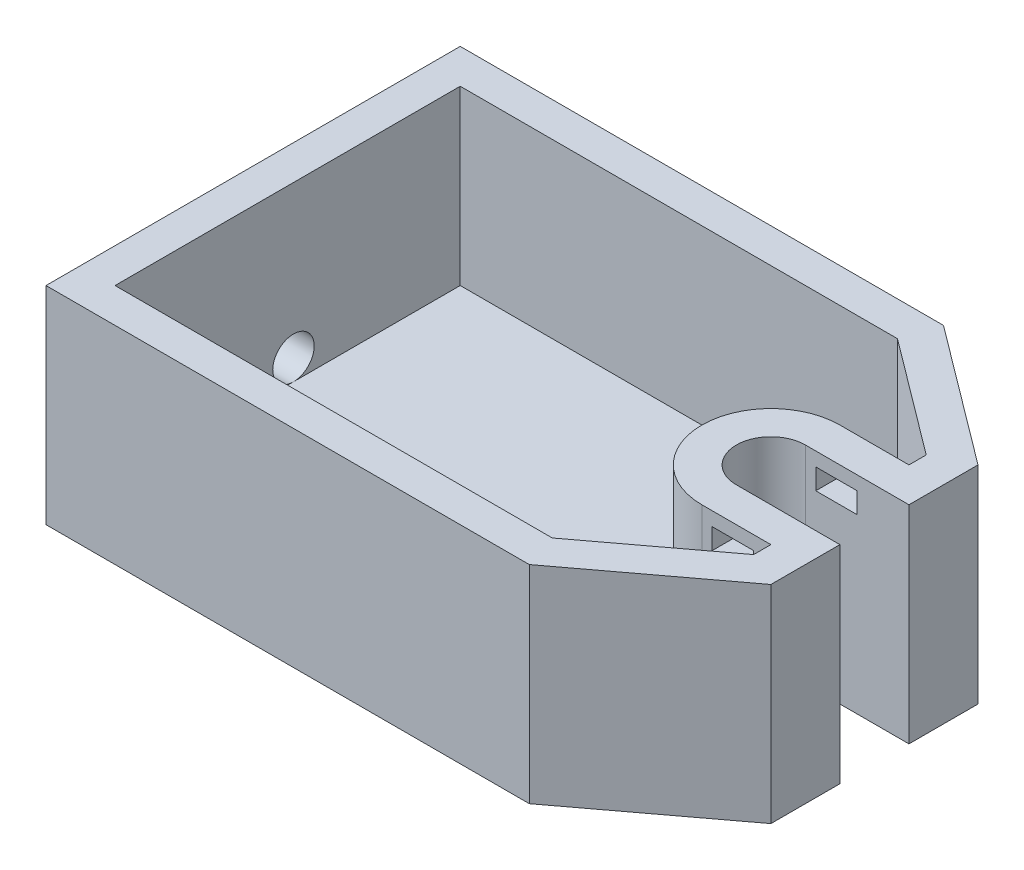
ISO-10303-21;
HEADER;
FILE_DESCRIPTION(('STEP AP214'),'2;1');
FILE_NAME('part.step','',(''),(''),'','','');
FILE_SCHEMA(('AUTOMOTIVE_DESIGN { 1 0 10303 214 1 1 1 1 }'));
ENDSEC;
DATA;
#1=APPLICATION_CONTEXT('core data for automotive mechanical design processes');
#2=APPLICATION_PROTOCOL_DEFINITION('international standard','automotive_design',2000,#1);
#3=PRODUCT_CONTEXT('',#1,'mechanical');
#4=PRODUCT('Part','Part','',(#3));
#5=PRODUCT_RELATED_PRODUCT_CATEGORY('part','',(#4));
#6=PRODUCT_DEFINITION_FORMATION('','',#4);
#7=PRODUCT_DEFINITION_CONTEXT('part definition',#1,'design');
#8=PRODUCT_DEFINITION('design','',#6,#7);
#9=PRODUCT_DEFINITION_SHAPE('','',#8);
#10=(LENGTH_UNIT() NAMED_UNIT(*) SI_UNIT(.MILLI.,.METRE.));
#11=(NAMED_UNIT(*) PLANE_ANGLE_UNIT() SI_UNIT($,.RADIAN.));
#12=(NAMED_UNIT(*) SI_UNIT($,.STERADIAN.) SOLID_ANGLE_UNIT());
#13=UNCERTAINTY_MEASURE_WITH_UNIT(LENGTH_MEASURE(1.E-05),#10,'distance_accuracy_value','');
#14=(GEOMETRIC_REPRESENTATION_CONTEXT(3) GLOBAL_UNCERTAINTY_ASSIGNED_CONTEXT((#13)) GLOBAL_UNIT_ASSIGNED_CONTEXT((#10,
#11,#12)) REPRESENTATION_CONTEXT('',''));
#15=CARTESIAN_POINT('',(0.,0.,0.));
#16=DIRECTION('',(0.,0.,1.));
#17=DIRECTION('',(1.,0.,0.));
#18=AXIS2_PLACEMENT_3D('',#15,#16,#17);
#19=CARTESIAN_POINT('',(228.6,76.2,0.));
#20=DIRECTION('',(1.,0.,0.));
#21=DIRECTION('',(0.,0.,-1.));
#22=AXIS2_PLACEMENT_3D('',#19,#20,#21);
#23=PLANE('',#22);
#24=DIRECTION('',(0.,0.,1.));
#25=VECTOR('',#24,1.);
#26=CARTESIAN_POINT('',(228.6,0.,0.));
#27=LINE('',#26,#25);
#28=CARTESIAN_POINT('',(228.6,0.,-114.3));
#29=VERTEX_POINT('',#28);
#30=CARTESIAN_POINT('',(228.6,0.,-88.9));
#31=VERTEX_POINT('',#30);
#32=EDGE_CURVE('E413',#29,#31,#27,.T.);
#33=ORIENTED_EDGE('',*,*,#32,.F.);
#34=DIRECTION('',(0.,-1.,0.));
#35=VECTOR('',#34,1.);
#36=CARTESIAN_POINT('',(228.6,76.2,-114.3));
#37=LINE('',#36,#35);
#38=CARTESIAN_POINT('',(228.6,76.2,-114.3));
#39=VERTEX_POINT('',#38);
#40=EDGE_CURVE('E12',#39,#29,#37,.T.);
#41=ORIENTED_EDGE('',*,*,#40,.F.);
#42=DIRECTION('',(0.,0.,1.));
#43=VECTOR('',#42,1.);
#44=CARTESIAN_POINT('',(228.6,76.2,0.));
#45=LINE('',#44,#43);
#46=CARTESIAN_POINT('',(228.6,76.2,-88.9));
#47=VERTEX_POINT('',#46);
#48=EDGE_CURVE('E414',#39,#47,#45,.T.);
#49=ORIENTED_EDGE('',*,*,#48,.T.);
#50=DIRECTION('',(0.,-1.,0.));
#51=VECTOR('',#50,1.);
#52=CARTESIAN_POINT('',(228.6,76.2,-88.9));
#53=LINE('',#52,#51);
#54=EDGE_CURVE('E443',#47,#31,#53,.T.);
#55=ORIENTED_EDGE('',*,*,#54,.T.);
#56=EDGE_LOOP('',(#33,#41,#49,#55));
#57=FACE_BOUND('',#56,.T.);
#58=ADVANCED_FACE('F37',(#57),#23,.T.);
#59=CARTESIAN_POINT('',(137.16,76.2,-182.88));
#60=DIRECTION('',(0.6,0.,-0.8));
#61=DIRECTION('',(-0.8,0.,-0.6));
#62=AXIS2_PLACEMENT_3D('',#59,#60,#61);
#63=PLANE('',#62);
#64=DIRECTION('',(0.8,0.,0.6));
#65=VECTOR('',#64,1.);
#66=CARTESIAN_POINT('',(137.16,0.,-182.88));
#67=LINE('',#66,#65);
#68=CARTESIAN_POINT('',(177.8,0.,-152.4));
#69=VERTEX_POINT('',#68);
#70=EDGE_CURVE('E446',#69,#29,#67,.T.);
#71=ORIENTED_EDGE('',*,*,#70,.F.);
#72=DIRECTION('',(0.,-1.,0.));
#73=VECTOR('',#72,1.);
#74=CARTESIAN_POINT('',(177.8,76.2,-152.4));
#75=LINE('',#74,#73);
#76=CARTESIAN_POINT('',(177.8,76.2,-152.4));
#77=VERTEX_POINT('',#76);
#78=EDGE_CURVE('E44',#77,#69,#75,.T.);
#79=ORIENTED_EDGE('',*,*,#78,.F.);
#80=DIRECTION('',(0.8,0.,0.6));
#81=VECTOR('',#80,1.);
#82=CARTESIAN_POINT('',(137.16,76.2,-182.88));
#83=LINE('',#82,#81);
#84=EDGE_CURVE('E417',#77,#39,#83,.T.);
#85=ORIENTED_EDGE('',*,*,#84,.T.);
#86=ORIENTED_EDGE('',*,*,#40,.T.);
#87=EDGE_LOOP('',(#71,#79,#85,#86));
#88=FACE_BOUND('',#87,.T.);
#89=ADVANCED_FACE('F493',(#88),#63,.T.);
#90=CARTESIAN_POINT('',(0.,76.2,-152.4));
#91=DIRECTION('',(0.,0.,-1.));
#92=DIRECTION('',(-1.,0.,0.));
#93=AXIS2_PLACEMENT_3D('',#90,#91,#92);
#94=PLANE('',#93);
#95=DIRECTION('',(1.,0.,0.));
#96=VECTOR('',#95,1.);
#97=CARTESIAN_POINT('',(0.,0.,-152.4));
#98=LINE('',#97,#96);
#99=CARTESIAN_POINT('',(0.,0.,-152.4));
#100=VERTEX_POINT('',#99);
#101=EDGE_CURVE('E449',#100,#69,#98,.T.);
#102=ORIENTED_EDGE('',*,*,#101,.F.);
#103=DIRECTION('',(0.,-1.,0.));
#104=VECTOR('',#103,1.);
#105=CARTESIAN_POINT('',(0.,76.2,-152.4));
#106=LINE('',#105,#104);
#107=CARTESIAN_POINT('',(0.,76.2,-152.4));
#108=VERTEX_POINT('',#107);
#109=EDGE_CURVE('E485',#108,#100,#106,.T.);
#110=ORIENTED_EDGE('',*,*,#109,.F.);
#111=DIRECTION('',(1.,0.,0.));
#112=VECTOR('',#111,1.);
#113=CARTESIAN_POINT('',(0.,76.2,-152.4));
#114=LINE('',#113,#112);
#115=EDGE_CURVE('E421',#108,#77,#114,.T.);
#116=ORIENTED_EDGE('',*,*,#115,.T.);
#117=ORIENTED_EDGE('',*,*,#78,.T.);
#118=EDGE_LOOP('',(#102,#110,#116,#117));
#119=FACE_BOUND('',#118,.T.);
#120=ADVANCED_FACE('F489',(#119),#94,.T.);
#121=CARTESIAN_POINT('',(0.,76.2,0.));
#122=DIRECTION('',(-1.,0.,0.));
#123=DIRECTION('',(0.,0.,1.));
#124=AXIS2_PLACEMENT_3D('',#121,#122,#123);
#125=PLANE('',#124);
#126=CARTESIAN_POINT('',(0.,20.32,-78.3433518149517));
#127=DIRECTION('',(-1.,0.,0.));
#128=DIRECTION('',(0.,0.,1.));
#129=AXIS2_PLACEMENT_3D('',#126,#127,#128);
#130=CIRCLE('',#129,7.62);
#131=CARTESIAN_POINT('',(0.,20.32,-70.7233518149518));
#132=VERTEX_POINT('',#131);
#133=EDGE_CURVE('E307',#132,#132,#130,.T.);
#134=ORIENTED_EDGE('',*,*,#133,.F.);
#135=EDGE_LOOP('',(#134));
#136=FACE_BOUND('',#135,.T.);
#137=DIRECTION('',(0.,1.,0.));
#138=VECTOR('',#137,1.);
#139=CARTESIAN_POINT('',(0.,15.24,-25.4850808170089));
#140=LINE('',#139,#138);
#141=CARTESIAN_POINT('',(0.,15.24,-25.4850808170089));
#142=VERTEX_POINT('',#141);
#143=CARTESIAN_POINT('',(0.,25.4,-25.4850808170089));
#144=VERTEX_POINT('',#143);
#145=EDGE_CURVE('E312',#142,#144,#140,.T.);
#146=ORIENTED_EDGE('',*,*,#145,.F.);
#147=DIRECTION('',(0.,0.,1.));
#148=VECTOR('',#147,1.);
#149=CARTESIAN_POINT('',(0.,15.24,-25.4850808170089));
#150=LINE('',#149,#148);
#151=CARTESIAN_POINT('',(0.,15.24,-35.6450808170089));
#152=VERTEX_POINT('',#151);
#153=EDGE_CURVE('E329',#152,#142,#150,.T.);
#154=ORIENTED_EDGE('',*,*,#153,.F.);
#155=DIRECTION('',(0.,-1.,0.));
#156=VECTOR('',#155,1.);
#157=CARTESIAN_POINT('',(0.,15.24,-35.6450808170089));
#158=LINE('',#157,#156);
#159=CARTESIAN_POINT('',(0.,25.4,-35.6450808170089));
#160=VERTEX_POINT('',#159);
#161=EDGE_CURVE('E326',#160,#152,#158,.T.);
#162=ORIENTED_EDGE('',*,*,#161,.F.);
#163=DIRECTION('',(0.,0.,-1.));
#164=VECTOR('',#163,1.);
#165=CARTESIAN_POINT('',(0.,25.4,-25.4850808170089));
#166=LINE('',#165,#164);
#167=EDGE_CURVE('E323',#144,#160,#166,.T.);
#168=ORIENTED_EDGE('',*,*,#167,.F.);
#169=EDGE_LOOP('',(#146,#154,#162,#168));
#170=FACE_BOUND('',#169,.T.);
#171=DIRECTION('',(0.,0.,-1.));
#172=VECTOR('',#171,1.);
#173=CARTESIAN_POINT('',(0.,0.,0.));
#174=LINE('',#173,#172);
#175=CARTESIAN_POINT('',(0.,0.,0.));
#176=VERTEX_POINT('',#175);
#177=EDGE_CURVE('E452',#176,#100,#174,.T.);
#178=ORIENTED_EDGE('',*,*,#177,.F.);
#179=DIRECTION('',(0.,-1.,0.));
#180=VECTOR('',#179,1.);
#181=CARTESIAN_POINT('',(0.,76.2,0.));
#182=LINE('',#181,#180);
#183=CARTESIAN_POINT('',(0.,76.2,0.));
#184=VERTEX_POINT('',#183);
#185=EDGE_CURVE('E483',#184,#176,#182,.T.);
#186=ORIENTED_EDGE('',*,*,#185,.F.);
#187=DIRECTION('',(0.,0.,-1.));
#188=VECTOR('',#187,1.);
#189=CARTESIAN_POINT('',(0.,76.2,0.));
#190=LINE('',#189,#188);
#191=EDGE_CURVE('E424',#184,#108,#190,.T.);
#192=ORIENTED_EDGE('',*,*,#191,.T.);
#193=ORIENTED_EDGE('',*,*,#109,.T.);
#194=EDGE_LOOP('',(#178,#186,#192,#193));
#195=FACE_BOUND('',#194,.T.);
#196=ADVANCED_FACE('F500',(#136,#170,#195),#125,.T.);
#197=CARTESIAN_POINT('',(0.,76.2,0.));
#198=DIRECTION('',(0.,0.,-1.));
#199=DIRECTION('',(-1.,0.,0.));
#200=AXIS2_PLACEMENT_3D('',#197,#198,#199);
#201=PLANE('',#200);
#202=DIRECTION('',(1.,0.,0.));
#203=VECTOR('',#202,1.);
#204=CARTESIAN_POINT('',(0.,0.,0.));
#205=LINE('',#204,#203);
#206=CARTESIAN_POINT('',(177.8,0.,0.));
#207=VERTEX_POINT('',#206);
#208=EDGE_CURVE('E455',#176,#207,#205,.T.);
#209=ORIENTED_EDGE('',*,*,#208,.T.);
#210=DIRECTION('',(0.,-1.,0.));
#211=VECTOR('',#210,1.);
#212=CARTESIAN_POINT('',(177.8,76.2,0.));
#213=LINE('',#212,#211);
#214=CARTESIAN_POINT('',(177.8,76.2,0.));
#215=VERTEX_POINT('',#214);
#216=EDGE_CURVE('E481',#215,#207,#213,.T.);
#217=ORIENTED_EDGE('',*,*,#216,.F.);
#218=DIRECTION('',(1.,0.,0.));
#219=VECTOR('',#218,1.);
#220=CARTESIAN_POINT('',(0.,76.2,0.));
#221=LINE('',#220,#219);
#222=EDGE_CURVE('E427',#184,#215,#221,.T.);
#223=ORIENTED_EDGE('',*,*,#222,.F.);
#224=ORIENTED_EDGE('',*,*,#185,.T.);
#225=EDGE_LOOP('',(#209,#217,#223,#224));
#226=FACE_BOUND('',#225,.T.);
#227=ADVANCED_FACE('F529',(#226),#201,.F.);
#228=CARTESIAN_POINT('',(64.0080000000001,76.2,85.344));
#229=DIRECTION('',(0.6,0.,0.8));
#230=DIRECTION('',(0.8,0.,-0.6));
#231=AXIS2_PLACEMENT_3D('',#228,#229,#230);
#232=PLANE('',#231);
#233=DIRECTION('',(-0.8,0.,0.6));
#234=VECTOR('',#233,1.);
#235=CARTESIAN_POINT('',(64.0080000000001,0.,85.344));
#236=LINE('',#235,#234);
#237=CARTESIAN_POINT('',(228.6,0.,-38.1));
#238=VERTEX_POINT('',#237);
#239=EDGE_CURVE('E458',#238,#207,#236,.T.);
#240=ORIENTED_EDGE('',*,*,#239,.F.);
#241=DIRECTION('',(0.,-1.,0.));
#242=VECTOR('',#241,1.);
#243=CARTESIAN_POINT('',(228.6,76.2,-38.1));
#244=LINE('',#243,#242);
#245=CARTESIAN_POINT('',(228.6,76.2,-38.1));
#246=VERTEX_POINT('',#245);
#247=EDGE_CURVE('E479',#246,#238,#244,.T.);
#248=ORIENTED_EDGE('',*,*,#247,.F.);
#249=DIRECTION('',(-0.8,0.,0.6));
#250=VECTOR('',#249,1.);
#251=CARTESIAN_POINT('',(64.0080000000001,76.2,85.344));
#252=LINE('',#251,#250);
#253=EDGE_CURVE('E429',#246,#215,#252,.T.);
#254=ORIENTED_EDGE('',*,*,#253,.T.);
#255=ORIENTED_EDGE('',*,*,#216,.T.);
#256=EDGE_LOOP('',(#240,#248,#254,#255));
#257=FACE_BOUND('',#256,.T.);
#258=ADVANCED_FACE('F526',(#257),#232,.T.);
#259=CARTESIAN_POINT('',(228.6,76.2,0.));
#260=DIRECTION('',(1.,0.,0.));
#261=DIRECTION('',(0.,0.,-1.));
#262=AXIS2_PLACEMENT_3D('',#259,#260,#261);
#263=PLANE('',#262);
#264=DIRECTION('',(0.,0.,1.));
#265=VECTOR('',#264,1.);
#266=CARTESIAN_POINT('',(228.6,0.,0.));
#267=LINE('',#266,#265);
#268=CARTESIAN_POINT('',(228.6,0.,-63.5));
#269=VERTEX_POINT('',#268);
#270=EDGE_CURVE('E461',#269,#238,#267,.T.);
#271=ORIENTED_EDGE('',*,*,#270,.F.);
#272=DIRECTION('',(0.,-1.,0.));
#273=VECTOR('',#272,1.);
#274=CARTESIAN_POINT('',(228.6,76.2,-63.5));
#275=LINE('',#274,#273);
#276=CARTESIAN_POINT('',(228.6,76.2,-63.5));
#277=VERTEX_POINT('',#276);
#278=EDGE_CURVE('E477',#277,#269,#275,.T.);
#279=ORIENTED_EDGE('',*,*,#278,.F.);
#280=DIRECTION('',(0.,0.,1.));
#281=VECTOR('',#280,1.);
#282=CARTESIAN_POINT('',(228.6,76.2,0.));
#283=LINE('',#282,#281);
#284=EDGE_CURVE('E432',#277,#246,#283,.T.);
#285=ORIENTED_EDGE('',*,*,#284,.T.);
#286=ORIENTED_EDGE('',*,*,#247,.T.);
#287=EDGE_LOOP('',(#271,#279,#285,#286));
#288=FACE_BOUND('',#287,.T.);
#289=ADVANCED_FACE('F522',(#288),#263,.T.);
#290=CARTESIAN_POINT('',(0.,76.2,-63.5));
#291=DIRECTION('',(0.,0.,-1.));
#292=DIRECTION('',(-1.,0.,0.));
#293=AXIS2_PLACEMENT_3D('',#290,#291,#292);
#294=PLANE('',#293);
#295=DIRECTION('',(0.,-1.,0.));
#296=VECTOR('',#295,1.);
#297=CARTESIAN_POINT('',(209.55,76.2,-63.5));
#298=LINE('',#297,#296);
#299=CARTESIAN_POINT('',(209.55,71.12,-63.5));
#300=VERTEX_POINT('',#299);
#301=CARTESIAN_POINT('',(209.55,63.5,-63.5));
#302=VERTEX_POINT('',#301);
#303=EDGE_CURVE('E305',#300,#302,#298,.T.);
#304=ORIENTED_EDGE('',*,*,#303,.F.);
#305=DIRECTION('',(1.,0.,0.));
#306=VECTOR('',#305,1.);
#307=CARTESIAN_POINT('',(0.,71.12,-63.5));
#308=LINE('',#307,#306);
#309=CARTESIAN_POINT('',(194.31,71.12,-63.5));
#310=VERTEX_POINT('',#309);
#311=EDGE_CURVE('E291',#310,#300,#308,.T.);
#312=ORIENTED_EDGE('',*,*,#311,.F.);
#313=DIRECTION('',(0.,1.,0.));
#314=VECTOR('',#313,1.);
#315=CARTESIAN_POINT('',(194.31,76.2,-63.5));
#316=LINE('',#315,#314);
#317=CARTESIAN_POINT('',(194.31,63.5,-63.5));
#318=VERTEX_POINT('',#317);
#319=EDGE_CURVE('E252',#318,#310,#316,.T.);
#320=ORIENTED_EDGE('',*,*,#319,.F.);
#321=DIRECTION('',(-1.,0.,0.));
#322=VECTOR('',#321,1.);
#323=CARTESIAN_POINT('',(0.,63.5,-63.5));
#324=LINE('',#323,#322);
#325=EDGE_CURVE('E300',#302,#318,#324,.T.);
#326=ORIENTED_EDGE('',*,*,#325,.F.);
#327=EDGE_LOOP('',(#304,#312,#320,#326));
#328=FACE_BOUND('',#327,.T.);
#329=DIRECTION('',(1.,0.,0.));
#330=VECTOR('',#329,1.);
#331=CARTESIAN_POINT('',(0.,0.,-63.5));
#332=LINE('',#331,#330);
#333=CARTESIAN_POINT('',(190.5,0.,-63.5));
#334=VERTEX_POINT('',#333);
#335=EDGE_CURVE('E464',#334,#269,#332,.T.);
#336=ORIENTED_EDGE('',*,*,#335,.F.);
#337=DIRECTION('',(0.,-1.,0.));
#338=VECTOR('',#337,1.);
#339=CARTESIAN_POINT('',(190.5,76.2,-63.5));
#340=LINE('',#339,#338);
#341=CARTESIAN_POINT('',(190.5,76.2,-63.5));
#342=VERTEX_POINT('',#341);
#343=EDGE_CURVE('E475',#342,#334,#340,.T.);
#344=ORIENTED_EDGE('',*,*,#343,.F.);
#345=DIRECTION('',(1.,0.,0.));
#346=VECTOR('',#345,1.);
#347=CARTESIAN_POINT('',(0.,76.2,-63.5));
#348=LINE('',#347,#346);
#349=EDGE_CURVE('E435',#342,#277,#348,.T.);
#350=ORIENTED_EDGE('',*,*,#349,.T.);
#351=ORIENTED_EDGE('',*,*,#278,.T.);
#352=EDGE_LOOP('',(#336,#344,#350,#351));
#353=FACE_BOUND('',#352,.T.);
#354=ADVANCED_FACE('F518',(#328,#353),#294,.T.);
#355=CARTESIAN_POINT('',(190.5,76.2,-76.2));
#356=DIRECTION('',(0.,-1.,0.));
#357=DIRECTION('',(0.,0.,-1.));
#358=AXIS2_PLACEMENT_3D('',#355,#356,#357);
#359=CYLINDRICAL_SURFACE('',#358,12.7);
#360=CARTESIAN_POINT('',(190.5,0.,-76.2));
#361=DIRECTION('',(0.,1.,0.));
#362=DIRECTION('',(0.,0.,1.));
#363=AXIS2_PLACEMENT_3D('',#360,#361,#362);
#364=CIRCLE('',#363,12.7);
#365=CARTESIAN_POINT('',(190.5,0.,-88.9));
#366=VERTEX_POINT('',#365);
#367=EDGE_CURVE('E467',#366,#334,#364,.T.);
#368=ORIENTED_EDGE('',*,*,#367,.F.);
#369=DIRECTION('',(0.,-1.,0.));
#370=VECTOR('',#369,1.);
#371=CARTESIAN_POINT('',(190.5,76.2,-88.9));
#372=LINE('',#371,#370);
#373=CARTESIAN_POINT('',(190.5,76.2,-88.9));
#374=VERTEX_POINT('',#373);
#375=EDGE_CURVE('E473',#374,#366,#372,.T.);
#376=ORIENTED_EDGE('',*,*,#375,.F.);
#377=CARTESIAN_POINT('',(190.5,76.2,-76.2));
#378=DIRECTION('',(0.,1.,0.));
#379=DIRECTION('',(0.,0.,1.));
#380=AXIS2_PLACEMENT_3D('',#377,#378,#379);
#381=CIRCLE('',#380,12.7);
#382=EDGE_CURVE('E438',#374,#342,#381,.T.);
#383=ORIENTED_EDGE('',*,*,#382,.T.);
#384=ORIENTED_EDGE('',*,*,#343,.T.);
#385=EDGE_LOOP('',(#368,#376,#383,#384));
#386=FACE_BOUND('',#385,.T.);
#387=ADVANCED_FACE('F514',(#386),#359,.F.);
#388=CARTESIAN_POINT('',(0.,76.2,-88.9));
#389=DIRECTION('',(0.,0.,-1.));
#390=DIRECTION('',(-1.,0.,0.));
#391=AXIS2_PLACEMENT_3D('',#388,#389,#390);
#392=PLANE('',#391);
#393=DIRECTION('',(1.,0.,0.));
#394=VECTOR('',#393,1.);
#395=CARTESIAN_POINT('',(0.,71.12,-88.9));
#396=LINE('',#395,#394);
#397=CARTESIAN_POINT('',(194.31,71.12,-88.9));
#398=VERTEX_POINT('',#397);
#399=CARTESIAN_POINT('',(209.55,71.12,-88.9));
#400=VERTEX_POINT('',#399);
#401=EDGE_CURVE('E287',#398,#400,#396,.T.);
#402=ORIENTED_EDGE('',*,*,#401,.T.);
#403=DIRECTION('',(0.,-1.,0.));
#404=VECTOR('',#403,1.);
#405=CARTESIAN_POINT('',(209.55,76.2,-88.9));
#406=LINE('',#405,#404);
#407=CARTESIAN_POINT('',(209.55,63.5,-88.9));
#408=VERTEX_POINT('',#407);
#409=EDGE_CURVE('E302',#400,#408,#406,.T.);
#410=ORIENTED_EDGE('',*,*,#409,.T.);
#411=DIRECTION('',(-1.,0.,0.));
#412=VECTOR('',#411,1.);
#413=CARTESIAN_POINT('',(0.,63.5,-88.9));
#414=LINE('',#413,#412);
#415=CARTESIAN_POINT('',(194.31,63.5,-88.9));
#416=VERTEX_POINT('',#415);
#417=EDGE_CURVE('E297',#408,#416,#414,.T.);
#418=ORIENTED_EDGE('',*,*,#417,.T.);
#419=DIRECTION('',(0.,1.,0.));
#420=VECTOR('',#419,1.);
#421=CARTESIAN_POINT('',(194.31,76.2,-88.9));
#422=LINE('',#421,#420);
#423=EDGE_CURVE('E293',#416,#398,#422,.T.);
#424=ORIENTED_EDGE('',*,*,#423,.T.);
#425=EDGE_LOOP('',(#402,#410,#418,#424));
#426=FACE_BOUND('',#425,.T.);
#427=DIRECTION('',(1.,0.,0.));
#428=VECTOR('',#427,1.);
#429=CARTESIAN_POINT('',(0.,0.,-88.9));
#430=LINE('',#429,#428);
#431=EDGE_CURVE('E418',#366,#31,#430,.T.);
#432=ORIENTED_EDGE('',*,*,#431,.T.);
#433=ORIENTED_EDGE('',*,*,#54,.F.);
#434=DIRECTION('',(1.,0.,0.));
#435=VECTOR('',#434,1.);
#436=CARTESIAN_POINT('',(0.,76.2,-88.9));
#437=LINE('',#436,#435);
#438=EDGE_CURVE('E441',#374,#47,#437,.T.);
#439=ORIENTED_EDGE('',*,*,#438,.F.);
#440=ORIENTED_EDGE('',*,*,#375,.T.);
#441=EDGE_LOOP('',(#432,#433,#439,#440));
#442=FACE_BOUND('',#441,.T.);
#443=ADVANCED_FACE('F656',(#426,#442),#392,.F.);
#444=CARTESIAN_POINT('',(0.,76.2,0.));
#445=DIRECTION('',(0.,1.,0.));
#446=DIRECTION('',(0.,0.,1.));
#447=AXIS2_PLACEMENT_3D('',#444,#445,#446);
#448=PLANE('',#447);
#449=DIRECTION('',(1.,0.,0.));
#450=VECTOR('',#449,1.);
#451=CARTESIAN_POINT('',(190.5,76.2,-101.6));
#452=LINE('',#451,#450);
#453=CARTESIAN_POINT('',(190.5,76.2,-101.6));
#454=VERTEX_POINT('',#453);
#455=CARTESIAN_POINT('',(215.9,76.2,-101.6));
#456=VERTEX_POINT('',#455);
#457=EDGE_CURVE('E341',#454,#456,#452,.T.);
#458=ORIENTED_EDGE('',*,*,#457,.F.);
#459=CARTESIAN_POINT('',(190.5,76.2,-76.2));
#460=DIRECTION('',(0.,-1.,0.));
#461=DIRECTION('',(0.,0.,1.));
#462=AXIS2_PLACEMENT_3D('',#459,#460,#461);
#463=CIRCLE('',#462,25.4);
#464=CARTESIAN_POINT('',(190.5,76.2,-50.8));
#465=VERTEX_POINT('',#464);
#466=EDGE_CURVE('E389',#465,#454,#463,.T.);
#467=ORIENTED_EDGE('',*,*,#466,.F.);
#468=DIRECTION('',(-1.,0.,0.));
#469=VECTOR('',#468,1.);
#470=CARTESIAN_POINT('',(215.9,76.2,-50.8));
#471=LINE('',#470,#469);
#472=CARTESIAN_POINT('',(215.9,76.2,-50.8));
#473=VERTEX_POINT('',#472);
#474=EDGE_CURVE('E386',#473,#465,#471,.T.);
#475=ORIENTED_EDGE('',*,*,#474,.F.);
#476=DIRECTION('',(0.,0.,-1.));
#477=VECTOR('',#476,1.);
#478=CARTESIAN_POINT('',(215.9,76.2,-44.45));
#479=LINE('',#478,#477);
#480=CARTESIAN_POINT('',(215.9,76.2,-44.45));
#481=VERTEX_POINT('',#480);
#482=EDGE_CURVE('E383',#481,#473,#479,.T.);
#483=ORIENTED_EDGE('',*,*,#482,.F.);
#484=DIRECTION('',(0.8,0.,-0.600000000000001));
#485=VECTOR('',#484,1.);
#486=CARTESIAN_POINT('',(173.566666666667,76.2,-12.7));
#487=LINE('',#486,#485);
#488=CARTESIAN_POINT('',(173.566666666667,76.2,-12.7));
#489=VERTEX_POINT('',#488);
#490=EDGE_CURVE('E380',#489,#481,#487,.T.);
#491=ORIENTED_EDGE('',*,*,#490,.F.);
#492=DIRECTION('',(1.,0.,0.));
#493=VECTOR('',#492,1.);
#494=CARTESIAN_POINT('',(12.7,76.2,-12.7));
#495=LINE('',#494,#493);
#496=CARTESIAN_POINT('',(12.7,76.2,-12.7));
#497=VERTEX_POINT('',#496);
#498=EDGE_CURVE('E377',#497,#489,#495,.T.);
#499=ORIENTED_EDGE('',*,*,#498,.F.);
#500=DIRECTION('',(0.,0.,1.));
#501=VECTOR('',#500,1.);
#502=CARTESIAN_POINT('',(12.7,76.2,-139.7));
#503=LINE('',#502,#501);
#504=CARTESIAN_POINT('',(12.7,76.2,-139.7));
#505=VERTEX_POINT('',#504);
#506=EDGE_CURVE('E374',#505,#497,#503,.T.);
#507=ORIENTED_EDGE('',*,*,#506,.F.);
#508=DIRECTION('',(-1.,0.,0.));
#509=VECTOR('',#508,1.);
#510=CARTESIAN_POINT('',(173.566666666667,76.2,-139.7));
#511=LINE('',#510,#509);
#512=CARTESIAN_POINT('',(173.566666666667,76.2,-139.7));
#513=VERTEX_POINT('',#512);
#514=EDGE_CURVE('E371',#513,#505,#511,.T.);
#515=ORIENTED_EDGE('',*,*,#514,.F.);
#516=DIRECTION('',(-0.8,0.,-0.6));
#517=VECTOR('',#516,1.);
#518=CARTESIAN_POINT('',(215.9,76.2,-107.95));
#519=LINE('',#518,#517);
#520=CARTESIAN_POINT('',(215.9,76.2,-107.95));
#521=VERTEX_POINT('',#520);
#522=EDGE_CURVE('E368',#521,#513,#519,.T.);
#523=ORIENTED_EDGE('',*,*,#522,.F.);
#524=DIRECTION('',(0.,0.,-1.));
#525=VECTOR('',#524,1.);
#526=CARTESIAN_POINT('',(215.9,76.2,-101.6));
#527=LINE('',#526,#525);
#528=EDGE_CURVE('E365',#456,#521,#527,.T.);
#529=ORIENTED_EDGE('',*,*,#528,.F.);
#530=EDGE_LOOP('',(#458,#467,#475,#483,#491,#499,#507,#515,#523,#529));
#531=FACE_BOUND('',#530,.T.);
#532=ORIENTED_EDGE('',*,*,#48,.F.);
#533=ORIENTED_EDGE('',*,*,#84,.F.);
#534=ORIENTED_EDGE('',*,*,#115,.F.);
#535=ORIENTED_EDGE('',*,*,#191,.F.);
#536=ORIENTED_EDGE('',*,*,#222,.T.);
#537=ORIENTED_EDGE('',*,*,#253,.F.);
#538=ORIENTED_EDGE('',*,*,#284,.F.);
#539=ORIENTED_EDGE('',*,*,#349,.F.);
#540=ORIENTED_EDGE('',*,*,#382,.F.);
#541=ORIENTED_EDGE('',*,*,#438,.T.);
#542=EDGE_LOOP('',(#532,#533,#534,#535,#536,#537,#538,#539,#540,#541));
#543=FACE_BOUND('',#542,.T.);
#544=ADVANCED_FACE('F505',(#531,#543),#448,.T.);
#545=CARTESIAN_POINT('',(0.,0.,0.));
#546=DIRECTION('',(0.,1.,0.));
#547=DIRECTION('',(0.,0.,1.));
#548=AXIS2_PLACEMENT_3D('',#545,#546,#547);
#549=PLANE('',#548);
#550=ORIENTED_EDGE('',*,*,#32,.T.);
#551=ORIENTED_EDGE('',*,*,#431,.F.);
#552=ORIENTED_EDGE('',*,*,#367,.T.);
#553=ORIENTED_EDGE('',*,*,#335,.T.);
#554=ORIENTED_EDGE('',*,*,#270,.T.);
#555=ORIENTED_EDGE('',*,*,#239,.T.);
#556=ORIENTED_EDGE('',*,*,#208,.F.);
#557=ORIENTED_EDGE('',*,*,#177,.T.);
#558=ORIENTED_EDGE('',*,*,#101,.T.);
#559=ORIENTED_EDGE('',*,*,#70,.T.);
#560=EDGE_LOOP('',(#550,#551,#552,#553,#554,#555,#556,#557,#558,#559));
#561=FACE_BOUND('',#560,.T.);
#562=ADVANCED_FACE('F496',(#561),#549,.F.);
#563=CARTESIAN_POINT('',(190.5,-239.623120754238,-101.6));
#564=DIRECTION('',(0.,0.,1.));
#565=DIRECTION('',(1.,0.,0.));
#566=AXIS2_PLACEMENT_3D('',#563,#564,#565);
#567=PLANE('',#566);
#568=DIRECTION('',(-1.,0.,0.));
#569=VECTOR('',#568,1.);
#570=CARTESIAN_POINT('',(209.55,63.5,-101.6));
#571=LINE('',#570,#569);
#572=CARTESIAN_POINT('',(209.55,63.5,-101.6));
#573=VERTEX_POINT('',#572);
#574=CARTESIAN_POINT('',(194.31,63.5,-101.6));
#575=VERTEX_POINT('',#574);
#576=EDGE_CURVE('E943',#573,#575,#571,.T.);
#577=ORIENTED_EDGE('',*,*,#576,.F.);
#578=DIRECTION('',(0.,-1.,0.));
#579=VECTOR('',#578,1.);
#580=CARTESIAN_POINT('',(209.55,63.5,-101.6));
#581=LINE('',#580,#579);
#582=CARTESIAN_POINT('',(209.55,71.12,-101.6));
#583=VERTEX_POINT('',#582);
#584=EDGE_CURVE('E288',#583,#573,#581,.T.);
#585=ORIENTED_EDGE('',*,*,#584,.F.);
#586=DIRECTION('',(1.,0.,0.));
#587=VECTOR('',#586,1.);
#588=CARTESIAN_POINT('',(209.55,71.12,-101.6));
#589=LINE('',#588,#587);
#590=CARTESIAN_POINT('',(194.31,71.12,-101.6));
#591=VERTEX_POINT('',#590);
#592=EDGE_CURVE('E285',#591,#583,#589,.T.);
#593=ORIENTED_EDGE('',*,*,#592,.F.);
#594=DIRECTION('',(0.,1.,0.));
#595=VECTOR('',#594,1.);
#596=CARTESIAN_POINT('',(194.31,63.5,-101.6));
#597=LINE('',#596,#595);
#598=EDGE_CURVE('E277',#575,#591,#597,.T.);
#599=ORIENTED_EDGE('',*,*,#598,.F.);
#600=EDGE_LOOP('',(#577,#585,#593,#599));
#601=FACE_BOUND('',#600,.T.);
#602=DIRECTION('',(-1.,0.,0.));
#603=VECTOR('',#602,1.);
#604=CARTESIAN_POINT('',(190.5,12.7,-101.6));
#605=LINE('',#604,#603);
#606=CARTESIAN_POINT('',(215.9,12.7,-101.6));
#607=VERTEX_POINT('',#606);
#608=CARTESIAN_POINT('',(190.5,12.7,-101.6));
#609=VERTEX_POINT('',#608);
#610=EDGE_CURVE('E361',#607,#609,#605,.T.);
#611=ORIENTED_EDGE('',*,*,#610,.T.);
#612=DIRECTION('',(0.,1.,0.));
#613=VECTOR('',#612,1.);
#614=CARTESIAN_POINT('',(190.5,-239.623120754238,-101.6));
#615=LINE('',#614,#613);
#616=EDGE_CURVE('E345',#609,#454,#615,.T.);
#617=ORIENTED_EDGE('',*,*,#616,.T.);
#618=ORIENTED_EDGE('',*,*,#457,.T.);
#619=DIRECTION('',(0.,1.,0.));
#620=VECTOR('',#619,1.);
#621=CARTESIAN_POINT('',(215.9,-239.623120754238,-101.6));
#622=LINE('',#621,#620);
#623=EDGE_CURVE('E392',#607,#456,#622,.T.);
#624=ORIENTED_EDGE('',*,*,#623,.F.);
#625=EDGE_LOOP('',(#611,#617,#618,#624));
#626=FACE_BOUND('',#625,.T.);
#627=ADVANCED_FACE('F668',(#601,#626),#567,.F.);
#628=CARTESIAN_POINT('',(190.5,-239.623120754238,-76.2));
#629=DIRECTION('',(0.,1.,0.));
#630=DIRECTION('',(0.,0.,1.));
#631=AXIS2_PLACEMENT_3D('',#628,#629,#630);
#632=CYLINDRICAL_SURFACE('',#631,25.4);
#633=CARTESIAN_POINT('',(190.5,12.7,-76.2));
#634=DIRECTION('',(0.,1.,0.));
#635=DIRECTION('',(0.,0.,1.));
#636=AXIS2_PLACEMENT_3D('',#633,#634,#635);
#637=CIRCLE('',#636,25.4);
#638=CARTESIAN_POINT('',(190.5,12.7,-50.8));
#639=VERTEX_POINT('',#638);
#640=EDGE_CURVE('E359',#609,#639,#637,.T.);
#641=ORIENTED_EDGE('',*,*,#640,.T.);
#642=DIRECTION('',(0.,1.,0.));
#643=VECTOR('',#642,1.);
#644=CARTESIAN_POINT('',(190.5,-239.623120754238,-50.8));
#645=LINE('',#644,#643);
#646=EDGE_CURVE('E394',#639,#465,#645,.T.);
#647=ORIENTED_EDGE('',*,*,#646,.T.);
#648=ORIENTED_EDGE('',*,*,#466,.T.);
#649=ORIENTED_EDGE('',*,*,#616,.F.);
#650=EDGE_LOOP('',(#641,#647,#648,#649));
#651=FACE_BOUND('',#650,.T.);
#652=ADVANCED_FACE('F673',(#651),#632,.T.);
#653=CARTESIAN_POINT('',(215.9,-239.623120754238,-50.8));
#654=DIRECTION('',(0.,0.,-1.));
#655=DIRECTION('',(-1.,0.,0.));
#656=AXIS2_PLACEMENT_3D('',#653,#654,#655);
#657=PLANE('',#656);
#658=DIRECTION('',(-1.,0.,0.));
#659=VECTOR('',#658,1.);
#660=CARTESIAN_POINT('',(209.55,71.12,-50.8));
#661=LINE('',#660,#659);
#662=CARTESIAN_POINT('',(209.55,71.12,-50.8));
#663=VERTEX_POINT('',#662);
#664=CARTESIAN_POINT('',(194.31,71.12,-50.8));
#665=VERTEX_POINT('',#664);
#666=EDGE_CURVE('E258',#663,#665,#661,.T.);
#667=ORIENTED_EDGE('',*,*,#666,.F.);
#668=DIRECTION('',(0.,1.,0.));
#669=VECTOR('',#668,1.);
#670=CARTESIAN_POINT('',(209.55,63.5,-50.8));
#671=LINE('',#670,#669);
#672=CARTESIAN_POINT('',(209.55,63.5,-50.8));
#673=VERTEX_POINT('',#672);
#674=EDGE_CURVE('E264',#673,#663,#671,.T.);
#675=ORIENTED_EDGE('',*,*,#674,.F.);
#676=DIRECTION('',(1.,0.,0.));
#677=VECTOR('',#676,1.);
#678=CARTESIAN_POINT('',(209.55,63.5,-50.8));
#679=LINE('',#678,#677);
#680=CARTESIAN_POINT('',(194.31,63.5,-50.8));
#681=VERTEX_POINT('',#680);
#682=EDGE_CURVE('E269',#681,#673,#679,.T.);
#683=ORIENTED_EDGE('',*,*,#682,.F.);
#684=DIRECTION('',(0.,-1.,0.));
#685=VECTOR('',#684,1.);
#686=CARTESIAN_POINT('',(194.31,63.5,-50.8));
#687=LINE('',#686,#685);
#688=EDGE_CURVE('E249',#665,#681,#687,.T.);
#689=ORIENTED_EDGE('',*,*,#688,.F.);
#690=EDGE_LOOP('',(#667,#675,#683,#689));
#691=FACE_BOUND('',#690,.T.);
#692=DIRECTION('',(1.,0.,0.));
#693=VECTOR('',#692,1.);
#694=CARTESIAN_POINT('',(215.9,12.7,-50.8));
#695=LINE('',#694,#693);
#696=CARTESIAN_POINT('',(215.9,12.7,-50.8));
#697=VERTEX_POINT('',#696);
#698=EDGE_CURVE('E357',#639,#697,#695,.T.);
#699=ORIENTED_EDGE('',*,*,#698,.T.);
#700=DIRECTION('',(0.,1.,0.));
#701=VECTOR('',#700,1.);
#702=CARTESIAN_POINT('',(215.9,-239.623120754238,-50.8));
#703=LINE('',#702,#701);
#704=EDGE_CURVE('E396',#697,#473,#703,.T.);
#705=ORIENTED_EDGE('',*,*,#704,.T.);
#706=ORIENTED_EDGE('',*,*,#474,.T.);
#707=ORIENTED_EDGE('',*,*,#646,.F.);
#708=EDGE_LOOP('',(#699,#705,#706,#707));
#709=FACE_BOUND('',#708,.T.);
#710=ADVANCED_FACE('F266',(#691,#709),#657,.F.);
#711=CARTESIAN_POINT('',(215.9,-239.623120754238,-44.45));
#712=DIRECTION('',(1.,0.,0.));
#713=DIRECTION('',(0.,0.,-1.));
#714=AXIS2_PLACEMENT_3D('',#711,#712,#713);
#715=PLANE('',#714);
#716=DIRECTION('',(0.,0.,1.));
#717=VECTOR('',#716,1.);
#718=CARTESIAN_POINT('',(215.9,12.7,-44.45));
#719=LINE('',#718,#717);
#720=CARTESIAN_POINT('',(215.9,12.7,-44.45));
#721=VERTEX_POINT('',#720);
#722=EDGE_CURVE('E355',#697,#721,#719,.T.);
#723=ORIENTED_EDGE('',*,*,#722,.T.);
#724=DIRECTION('',(0.,1.,0.));
#725=VECTOR('',#724,1.);
#726=CARTESIAN_POINT('',(215.9,-239.623120754238,-44.45));
#727=LINE('',#726,#725);
#728=EDGE_CURVE('E398',#721,#481,#727,.T.);
#729=ORIENTED_EDGE('',*,*,#728,.T.);
#730=ORIENTED_EDGE('',*,*,#482,.T.);
#731=ORIENTED_EDGE('',*,*,#704,.F.);
#732=EDGE_LOOP('',(#723,#729,#730,#731));
#733=FACE_BOUND('',#732,.T.);
#734=ADVANCED_FACE('F687',(#733),#715,.F.);
#735=CARTESIAN_POINT('',(173.566666666667,-239.623120754238,-12.7));
#736=DIRECTION('',(0.6,0.,0.8));
#737=DIRECTION('',(0.8,0.,-0.600000000000001));
#738=AXIS2_PLACEMENT_3D('',#735,#736,#737);
#739=PLANE('',#738);
#740=DIRECTION('',(-0.8,0.,0.600000000000001));
#741=VECTOR('',#740,1.);
#742=CARTESIAN_POINT('',(173.566666666667,12.7,-12.7));
#743=LINE('',#742,#741);
#744=CARTESIAN_POINT('',(173.566666666667,12.7,-12.7));
#745=VERTEX_POINT('',#744);
#746=EDGE_CURVE('E353',#721,#745,#743,.T.);
#747=ORIENTED_EDGE('',*,*,#746,.T.);
#748=DIRECTION('',(0.,1.,0.));
#749=VECTOR('',#748,1.);
#750=CARTESIAN_POINT('',(173.566666666667,-239.623120754238,-12.7));
#751=LINE('',#750,#749);
#752=EDGE_CURVE('E400',#745,#489,#751,.T.);
#753=ORIENTED_EDGE('',*,*,#752,.T.);
#754=ORIENTED_EDGE('',*,*,#490,.T.);
#755=ORIENTED_EDGE('',*,*,#728,.F.);
#756=EDGE_LOOP('',(#747,#753,#754,#755));
#757=FACE_BOUND('',#756,.T.);
#758=ADVANCED_FACE('F766',(#757),#739,.F.);
#759=CARTESIAN_POINT('',(12.7,-239.623120754238,-12.7));
#760=DIRECTION('',(0.,0.,1.));
#761=DIRECTION('',(1.,0.,0.));
#762=AXIS2_PLACEMENT_3D('',#759,#760,#761);
#763=PLANE('',#762);
#764=DIRECTION('',(-1.,0.,0.));
#765=VECTOR('',#764,1.);
#766=CARTESIAN_POINT('',(12.7,12.7,-12.7));
#767=LINE('',#766,#765);
#768=CARTESIAN_POINT('',(12.7,12.7,-12.7));
#769=VERTEX_POINT('',#768);
#770=EDGE_CURVE('E351',#745,#769,#767,.T.);
#771=ORIENTED_EDGE('',*,*,#770,.T.);
#772=DIRECTION('',(0.,1.,0.));
#773=VECTOR('',#772,1.);
#774=CARTESIAN_POINT('',(12.7,-239.623120754238,-12.7));
#775=LINE('',#774,#773);
#776=EDGE_CURVE('E402',#769,#497,#775,.T.);
#777=ORIENTED_EDGE('',*,*,#776,.T.);
#778=ORIENTED_EDGE('',*,*,#498,.T.);
#779=ORIENTED_EDGE('',*,*,#752,.F.);
#780=EDGE_LOOP('',(#771,#777,#778,#779));
#781=FACE_BOUND('',#780,.T.);
#782=ADVANCED_FACE('F571',(#781),#763,.F.);
#783=CARTESIAN_POINT('',(12.7,-239.623120754238,-139.7));
#784=DIRECTION('',(-1.,0.,0.));
#785=DIRECTION('',(0.,0.,1.));
#786=AXIS2_PLACEMENT_3D('',#783,#784,#785);
#787=PLANE('',#786);
#788=DIRECTION('',(0.,0.,-1.));
#789=VECTOR('',#788,1.);
#790=CARTESIAN_POINT('',(12.7,15.24,-25.4850808170089));
#791=LINE('',#790,#789);
#792=CARTESIAN_POINT('',(12.7,15.24,-25.4850808170089));
#793=VERTEX_POINT('',#792);
#794=CARTESIAN_POINT('',(12.7,15.24,-35.6450808170089));
#795=VERTEX_POINT('',#794);
#796=EDGE_CURVE('E316',#793,#795,#791,.T.);
#797=ORIENTED_EDGE('',*,*,#796,.F.);
#798=DIRECTION('',(0.,-1.,0.));
#799=VECTOR('',#798,1.);
#800=CARTESIAN_POINT('',(12.7,15.24,-25.4850808170089));
#801=LINE('',#800,#799);
#802=CARTESIAN_POINT('',(12.7,25.4,-25.4850808170089));
#803=VERTEX_POINT('',#802);
#804=EDGE_CURVE('E319',#803,#793,#801,.T.);
#805=ORIENTED_EDGE('',*,*,#804,.F.);
#806=DIRECTION('',(0.,0.,1.));
#807=VECTOR('',#806,1.);
#808=CARTESIAN_POINT('',(12.7,25.4,-25.4850808170089));
#809=LINE('',#808,#807);
#810=CARTESIAN_POINT('',(12.7,25.4,-35.6450808170089));
#811=VERTEX_POINT('',#810);
#812=EDGE_CURVE('E321',#811,#803,#809,.T.);
#813=ORIENTED_EDGE('',*,*,#812,.F.);
#814=DIRECTION('',(0.,1.,0.));
#815=VECTOR('',#814,1.);
#816=CARTESIAN_POINT('',(12.7,15.24,-35.6450808170089));
#817=LINE('',#816,#815);
#818=EDGE_CURVE('E313',#795,#811,#817,.T.);
#819=ORIENTED_EDGE('',*,*,#818,.F.);
#820=EDGE_LOOP('',(#797,#805,#813,#819));
#821=FACE_BOUND('',#820,.T.);
#822=DIRECTION('',(0.,0.,-1.));
#823=VECTOR('',#822,1.);
#824=CARTESIAN_POINT('',(12.7,12.7,-139.7));
#825=LINE('',#824,#823);
#826=CARTESIAN_POINT('',(12.7,12.7,-78.3433518149517));
#827=VERTEX_POINT('',#826);
#828=EDGE_CURVE('E348',#769,#827,#825,.T.);
#829=ORIENTED_EDGE('',*,*,#828,.T.);
#830=CARTESIAN_POINT('',(12.7,20.32,-78.3433518149517));
#831=DIRECTION('',(-1.,0.,0.));
#832=DIRECTION('',(0.,0.,1.));
#833=AXIS2_PLACEMENT_3D('',#830,#831,#832);
#834=CIRCLE('',#833,7.62);
#835=EDGE_CURVE('E310',#827,#827,#834,.F.);
#836=ORIENTED_EDGE('',*,*,#835,.F.);
#837=CARTESIAN_POINT('',(12.7,12.7,-139.7));
#838=VERTEX_POINT('',#837);
#839=EDGE_CURVE('E347',#827,#838,#825,.T.);
#840=ORIENTED_EDGE('',*,*,#839,.T.);
#841=DIRECTION('',(0.,1.,0.));
#842=VECTOR('',#841,1.);
#843=CARTESIAN_POINT('',(12.7,-239.623120754238,-139.7));
#844=LINE('',#843,#842);
#845=EDGE_CURVE('E404',#838,#505,#844,.T.);
#846=ORIENTED_EDGE('',*,*,#845,.T.);
#847=ORIENTED_EDGE('',*,*,#506,.T.);
#848=ORIENTED_EDGE('',*,*,#776,.F.);
#849=EDGE_LOOP('',(#829,#836,#840,#846,#847,#848));
#850=FACE_BOUND('',#849,.T.);
#851=ADVANCED_FACE('F565',(#821,#850),#787,.F.);
#852=CARTESIAN_POINT('',(173.566666666667,-239.623120754238,-139.7));
#853=DIRECTION('',(0.,0.,-1.));
#854=DIRECTION('',(-1.,0.,0.));
#855=AXIS2_PLACEMENT_3D('',#852,#853,#854);
#856=PLANE('',#855);
#857=DIRECTION('',(1.,0.,0.));
#858=VECTOR('',#857,1.);
#859=CARTESIAN_POINT('',(173.566666666667,12.7,-139.7));
#860=LINE('',#859,#858);
#861=CARTESIAN_POINT('',(173.566666666667,12.7,-139.7));
#862=VERTEX_POINT('',#861);
#863=EDGE_CURVE('E344',#838,#862,#860,.T.);
#864=ORIENTED_EDGE('',*,*,#863,.T.);
#865=DIRECTION('',(0.,1.,0.));
#866=VECTOR('',#865,1.);
#867=CARTESIAN_POINT('',(173.566666666667,-239.623120754238,-139.7));
#868=LINE('',#867,#866);
#869=EDGE_CURVE('E406',#862,#513,#868,.T.);
#870=ORIENTED_EDGE('',*,*,#869,.T.);
#871=ORIENTED_EDGE('',*,*,#514,.T.);
#872=ORIENTED_EDGE('',*,*,#845,.F.);
#873=EDGE_LOOP('',(#864,#870,#871,#872));
#874=FACE_BOUND('',#873,.T.);
#875=ADVANCED_FACE('F570',(#874),#856,.F.);
#876=CARTESIAN_POINT('',(215.9,-239.623120754238,-107.95));
#877=DIRECTION('',(0.6,0.,-0.8));
#878=DIRECTION('',(-0.8,0.,-0.6));
#879=AXIS2_PLACEMENT_3D('',#876,#877,#878);
#880=PLANE('',#879);
#881=DIRECTION('',(0.8,0.,0.6));
#882=VECTOR('',#881,1.);
#883=CARTESIAN_POINT('',(215.9,12.7,-107.95));
#884=LINE('',#883,#882);
#885=CARTESIAN_POINT('',(215.9,12.7,-107.95));
#886=VERTEX_POINT('',#885);
#887=EDGE_CURVE('E342',#862,#886,#884,.T.);
#888=ORIENTED_EDGE('',*,*,#887,.T.);
#889=DIRECTION('',(0.,1.,0.));
#890=VECTOR('',#889,1.);
#891=CARTESIAN_POINT('',(215.9,-239.623120754238,-107.95));
#892=LINE('',#891,#890);
#893=EDGE_CURVE('E408',#886,#521,#892,.T.);
#894=ORIENTED_EDGE('',*,*,#893,.T.);
#895=ORIENTED_EDGE('',*,*,#522,.T.);
#896=ORIENTED_EDGE('',*,*,#869,.F.);
#897=EDGE_LOOP('',(#888,#894,#895,#896));
#898=FACE_BOUND('',#897,.T.);
#899=ADVANCED_FACE('F774',(#898),#880,.F.);
#900=CARTESIAN_POINT('',(215.9,-239.623120754238,-101.6));
#901=DIRECTION('',(1.,0.,0.));
#902=DIRECTION('',(0.,0.,-1.));
#903=AXIS2_PLACEMENT_3D('',#900,#901,#902);
#904=PLANE('',#903);
#905=DIRECTION('',(0.,0.,1.));
#906=VECTOR('',#905,1.);
#907=CARTESIAN_POINT('',(215.9,12.7,-101.6));
#908=LINE('',#907,#906);
#909=EDGE_CURVE('E363',#886,#607,#908,.T.);
#910=ORIENTED_EDGE('',*,*,#909,.T.);
#911=ORIENTED_EDGE('',*,*,#623,.T.);
#912=ORIENTED_EDGE('',*,*,#528,.T.);
#913=ORIENTED_EDGE('',*,*,#893,.F.);
#914=EDGE_LOOP('',(#910,#911,#912,#913));
#915=FACE_BOUND('',#914,.T.);
#916=ADVANCED_FACE('F560',(#915),#904,.F.);
#917=CARTESIAN_POINT('',(0.,12.7,0.));
#918=DIRECTION('',(0.,1.,0.));
#919=DIRECTION('',(0.,0.,1.));
#920=AXIS2_PLACEMENT_3D('',#917,#918,#919);
#921=PLANE('',#920);
#922=ORIENTED_EDGE('',*,*,#610,.F.);
#923=ORIENTED_EDGE('',*,*,#909,.F.);
#924=ORIENTED_EDGE('',*,*,#887,.F.);
#925=ORIENTED_EDGE('',*,*,#863,.F.);
#926=ORIENTED_EDGE('',*,*,#839,.F.);
#927=ORIENTED_EDGE('',*,*,#828,.F.);
#928=ORIENTED_EDGE('',*,*,#770,.F.);
#929=ORIENTED_EDGE('',*,*,#746,.F.);
#930=ORIENTED_EDGE('',*,*,#722,.F.);
#931=ORIENTED_EDGE('',*,*,#698,.F.);
#932=ORIENTED_EDGE('',*,*,#640,.F.);
#933=EDGE_LOOP('',(#922,#923,#924,#925,#926,#927,#928,#929,#930,#931,#932));
#934=FACE_BOUND('',#933,.T.);
#935=ADVANCED_FACE('F581',(#934),#921,.T.);
#936=CARTESIAN_POINT('',(34.252614690566,15.24,-25.4850808170089));
#937=DIRECTION('',(0.,0.,1.));
#938=DIRECTION('',(0.,-1.,0.));
#939=AXIS2_PLACEMENT_3D('',#936,#937,#938);
#940=PLANE('',#939);
#941=ORIENTED_EDGE('',*,*,#804,.T.);
#942=DIRECTION('',(-1.,0.,0.));
#943=VECTOR('',#942,1.);
#944=CARTESIAN_POINT('',(34.252614690566,15.24,-25.4850808170089));
#945=LINE('',#944,#943);
#946=EDGE_CURVE('E317',#793,#142,#945,.T.);
#947=ORIENTED_EDGE('',*,*,#946,.T.);
#948=ORIENTED_EDGE('',*,*,#145,.T.);
#949=DIRECTION('',(-1.,0.,0.));
#950=VECTOR('',#949,1.);
#951=CARTESIAN_POINT('',(34.252614690566,25.4,-25.4850808170089));
#952=LINE('',#951,#950);
#953=EDGE_CURVE('E332',#803,#144,#952,.T.);
#954=ORIENTED_EDGE('',*,*,#953,.F.);
#955=EDGE_LOOP('',(#941,#947,#948,#954));
#956=FACE_BOUND('',#955,.T.);
#957=ADVANCED_FACE('F586',(#956),#940,.F.);
#958=CARTESIAN_POINT('',(34.252614690566,15.24,-25.4850808170089));
#959=DIRECTION('',(0.,-1.,0.));
#960=DIRECTION('',(0.,0.,-1.));
#961=AXIS2_PLACEMENT_3D('',#958,#959,#960);
#962=PLANE('',#961);
#963=ORIENTED_EDGE('',*,*,#796,.T.);
#964=DIRECTION('',(-1.,0.,0.));
#965=VECTOR('',#964,1.);
#966=CARTESIAN_POINT('',(34.252614690566,15.24,-35.6450808170089));
#967=LINE('',#966,#965);
#968=EDGE_CURVE('E334',#795,#152,#967,.T.);
#969=ORIENTED_EDGE('',*,*,#968,.T.);
#970=ORIENTED_EDGE('',*,*,#153,.T.);
#971=ORIENTED_EDGE('',*,*,#946,.F.);
#972=EDGE_LOOP('',(#963,#969,#970,#971));
#973=FACE_BOUND('',#972,.T.);
#974=ADVANCED_FACE('F596',(#973),#962,.F.);
#975=CARTESIAN_POINT('',(34.252614690566,15.24,-35.6450808170089));
#976=DIRECTION('',(0.,0.,-1.));
#977=DIRECTION('',(-1.,0.,0.));
#978=AXIS2_PLACEMENT_3D('',#975,#976,#977);
#979=PLANE('',#978);
#980=ORIENTED_EDGE('',*,*,#818,.T.);
#981=DIRECTION('',(-1.,0.,0.));
#982=VECTOR('',#981,1.);
#983=CARTESIAN_POINT('',(34.252614690566,25.4,-35.6450808170089));
#984=LINE('',#983,#982);
#985=EDGE_CURVE('E336',#811,#160,#984,.T.);
#986=ORIENTED_EDGE('',*,*,#985,.T.);
#987=ORIENTED_EDGE('',*,*,#161,.T.);
#988=ORIENTED_EDGE('',*,*,#968,.F.);
#989=EDGE_LOOP('',(#980,#986,#987,#988));
#990=FACE_BOUND('',#989,.T.);
#991=ADVANCED_FACE('F606',(#990),#979,.F.);
#992=CARTESIAN_POINT('',(34.252614690566,25.4,-25.4850808170089));
#993=DIRECTION('',(0.,1.,0.));
#994=DIRECTION('',(0.,0.,1.));
#995=AXIS2_PLACEMENT_3D('',#992,#993,#994);
#996=PLANE('',#995);
#997=ORIENTED_EDGE('',*,*,#812,.T.);
#998=ORIENTED_EDGE('',*,*,#953,.T.);
#999=ORIENTED_EDGE('',*,*,#167,.T.);
#1000=ORIENTED_EDGE('',*,*,#985,.F.);
#1001=EDGE_LOOP('',(#997,#998,#999,#1000));
#1002=FACE_BOUND('',#1001,.T.);
#1003=ADVANCED_FACE('F616',(#1002),#996,.F.);
#1004=CARTESIAN_POINT('',(34.252614690566,20.32,-78.3433518149517));
#1005=DIRECTION('',(-1.,0.,0.));
#1006=DIRECTION('',(0.,0.,1.));
#1007=AXIS2_PLACEMENT_3D('',#1004,#1005,#1006);
#1008=CYLINDRICAL_SURFACE('',#1007,7.62);
#1009=ORIENTED_EDGE('',*,*,#835,.T.);
#1010=EDGE_LOOP('',(#1009));
#1011=FACE_BOUND('',#1010,.T.);
#1012=ORIENTED_EDGE('',*,*,#133,.T.);
#1013=EDGE_LOOP('',(#1012));
#1014=FACE_BOUND('',#1013,.T.);
#1015=ADVANCED_FACE('F626',(#1011,#1014),#1008,.F.);
#1016=CARTESIAN_POINT('',(209.55,71.12,-118.638837988548));
#1017=DIRECTION('',(0.,1.,0.));
#1018=DIRECTION('',(0.,0.,1.));
#1019=AXIS2_PLACEMENT_3D('',#1016,#1017,#1018);
#1020=PLANE('',#1019);
#1021=ORIENTED_EDGE('',*,*,#311,.T.);
#1022=DIRECTION('',(0.,0.,1.));
#1023=VECTOR('',#1022,1.);
#1024=CARTESIAN_POINT('',(209.55,71.12,-118.638837988548));
#1025=LINE('',#1024,#1023);
#1026=EDGE_CURVE('E261',#300,#663,#1025,.T.);
#1027=ORIENTED_EDGE('',*,*,#1026,.T.);
#1028=ORIENTED_EDGE('',*,*,#666,.T.);
#1029=DIRECTION('',(0.,0.,1.));
#1030=VECTOR('',#1029,1.);
#1031=CARTESIAN_POINT('',(194.31,71.12,-118.638837988548));
#1032=LINE('',#1031,#1030);
#1033=EDGE_CURVE('E51',#310,#665,#1032,.T.);
#1034=ORIENTED_EDGE('',*,*,#1033,.F.);
#1035=EDGE_LOOP('',(#1021,#1027,#1028,#1034));
#1036=FACE_BOUND('',#1035,.T.);
#1037=ADVANCED_FACE('F259',(#1036),#1020,.F.);
#1038=CARTESIAN_POINT('',(194.31,63.5,-118.638837988548));
#1039=DIRECTION('',(-1.,0.,0.));
#1040=DIRECTION('',(0.,0.,1.));
#1041=AXIS2_PLACEMENT_3D('',#1038,#1039,#1040);
#1042=PLANE('',#1041);
#1043=ORIENTED_EDGE('',*,*,#319,.T.);
#1044=ORIENTED_EDGE('',*,*,#1033,.T.);
#1045=ORIENTED_EDGE('',*,*,#688,.T.);
#1046=DIRECTION('',(0.,0.,1.));
#1047=VECTOR('',#1046,1.);
#1048=CARTESIAN_POINT('',(194.31,63.5,-118.638837988548));
#1049=LINE('',#1048,#1047);
#1050=EDGE_CURVE('E281',#318,#681,#1049,.T.);
#1051=ORIENTED_EDGE('',*,*,#1050,.F.);
#1052=EDGE_LOOP('',(#1043,#1044,#1045,#1051));
#1053=FACE_BOUND('',#1052,.T.);
#1054=ADVANCED_FACE('F246',(#1053),#1042,.F.);
#1055=CARTESIAN_POINT('',(209.55,63.5,-118.638837988548));
#1056=DIRECTION('',(0.,-1.,0.));
#1057=DIRECTION('',(0.,0.,-1.));
#1058=AXIS2_PLACEMENT_3D('',#1055,#1056,#1057);
#1059=PLANE('',#1058);
#1060=ORIENTED_EDGE('',*,*,#325,.T.);
#1061=ORIENTED_EDGE('',*,*,#1050,.T.);
#1062=ORIENTED_EDGE('',*,*,#682,.T.);
#1063=DIRECTION('',(0.,0.,1.));
#1064=VECTOR('',#1063,1.);
#1065=CARTESIAN_POINT('',(209.55,63.5,-118.638837988548));
#1066=LINE('',#1065,#1064);
#1067=EDGE_CURVE('E278',#302,#673,#1066,.T.);
#1068=ORIENTED_EDGE('',*,*,#1067,.F.);
#1069=EDGE_LOOP('',(#1060,#1061,#1062,#1068));
#1070=FACE_BOUND('',#1069,.T.);
#1071=ADVANCED_FACE('F705',(#1070),#1059,.F.);
#1072=CARTESIAN_POINT('',(209.55,63.5,-118.638837988548));
#1073=DIRECTION('',(1.,0.,0.));
#1074=DIRECTION('',(0.,0.,-1.));
#1075=AXIS2_PLACEMENT_3D('',#1072,#1073,#1074);
#1076=PLANE('',#1075);
#1077=ORIENTED_EDGE('',*,*,#303,.T.);
#1078=ORIENTED_EDGE('',*,*,#1067,.T.);
#1079=ORIENTED_EDGE('',*,*,#674,.T.);
#1080=ORIENTED_EDGE('',*,*,#1026,.F.);
#1081=EDGE_LOOP('',(#1077,#1078,#1079,#1080));
#1082=FACE_BOUND('',#1081,.T.);
#1083=ADVANCED_FACE('F715',(#1082),#1076,.F.);
#1084=EDGE_CURVE('E59',#583,#400,#1025,.T.);
#1085=ORIENTED_EDGE('',*,*,#1084,.F.);
#1086=ORIENTED_EDGE('',*,*,#584,.T.);
#1087=EDGE_CURVE('E274',#573,#408,#1066,.T.);
#1088=ORIENTED_EDGE('',*,*,#1087,.T.);
#1089=ORIENTED_EDGE('',*,*,#409,.F.);
#1090=EDGE_LOOP('',(#1085,#1086,#1088,#1089));
#1091=FACE_BOUND('',#1090,.T.);
#1092=ADVANCED_FACE('F726',(#1091),#1076,.F.);
#1093=ORIENTED_EDGE('',*,*,#1087,.F.);
#1094=ORIENTED_EDGE('',*,*,#576,.T.);
#1095=EDGE_CURVE('E279',#575,#416,#1049,.T.);
#1096=ORIENTED_EDGE('',*,*,#1095,.T.);
#1097=ORIENTED_EDGE('',*,*,#417,.F.);
#1098=EDGE_LOOP('',(#1093,#1094,#1096,#1097));
#1099=FACE_BOUND('',#1098,.T.);
#1100=ADVANCED_FACE('F718',(#1099),#1059,.F.);
#1101=ORIENTED_EDGE('',*,*,#1095,.F.);
#1102=ORIENTED_EDGE('',*,*,#598,.T.);
#1103=EDGE_CURVE('E254',#591,#398,#1032,.T.);
#1104=ORIENTED_EDGE('',*,*,#1103,.T.);
#1105=ORIENTED_EDGE('',*,*,#423,.F.);
#1106=EDGE_LOOP('',(#1101,#1102,#1104,#1105));
#1107=FACE_BOUND('',#1106,.T.);
#1108=ADVANCED_FACE('F707',(#1107),#1042,.F.);
#1109=ORIENTED_EDGE('',*,*,#1103,.F.);
#1110=ORIENTED_EDGE('',*,*,#592,.T.);
#1111=ORIENTED_EDGE('',*,*,#1084,.T.);
#1112=ORIENTED_EDGE('',*,*,#401,.F.);
#1113=EDGE_LOOP('',(#1109,#1110,#1111,#1112));
#1114=FACE_BOUND('',#1113,.T.);
#1115=ADVANCED_FACE('F697',(#1114),#1020,.F.);
#1116=CLOSED_SHELL('',(#58,#89,#120,#196,#227,#258,#289,#354,#387,#443,#544,#562,#627,#652,#710,
#734,#758,#782,#851,#875,#899,#916,#935,#957,#974,#991,#1003,#1015,#1037,#1054,#1071,#1083,
#1092,#1100,#1108,#1115));
#1117=MANIFOLD_SOLID_BREP('B2',#1116);
#1118=ADVANCED_BREP_SHAPE_REPRESENTATION('',(#18,#1117),#14);
#1119=SHAPE_DEFINITION_REPRESENTATION(#9,#1118);
ENDSEC;
END-ISO-10303-21;
